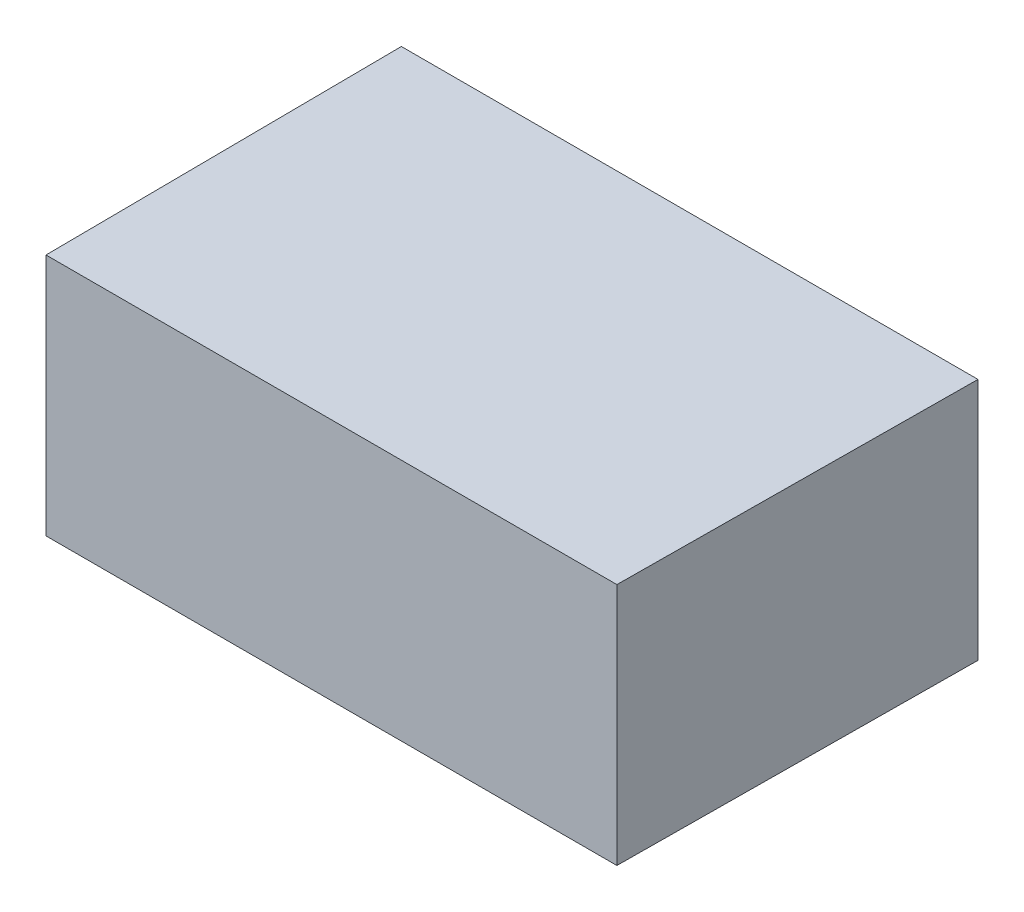
ISO-10303-21;
HEADER;
FILE_DESCRIPTION(('STEP AP214'),'2;1');
FILE_NAME('part.step','',(''),(''),'','','');
FILE_SCHEMA(('AUTOMOTIVE_DESIGN { 1 0 10303 214 1 1 1 1 }'));
ENDSEC;
DATA;
#1=APPLICATION_CONTEXT('core data for automotive mechanical design processes');
#2=APPLICATION_PROTOCOL_DEFINITION('international standard','automotive_design',2000,#1);
#3=PRODUCT_CONTEXT('',#1,'mechanical');
#4=PRODUCT('Part','Part','',(#3));
#5=PRODUCT_RELATED_PRODUCT_CATEGORY('part','',(#4));
#6=PRODUCT_DEFINITION_FORMATION('','',#4);
#7=PRODUCT_DEFINITION_CONTEXT('part definition',#1,'design');
#8=PRODUCT_DEFINITION('design','',#6,#7);
#9=PRODUCT_DEFINITION_SHAPE('','',#8);
#10=(LENGTH_UNIT() NAMED_UNIT(*) SI_UNIT(.MILLI.,.METRE.));
#11=(NAMED_UNIT(*) PLANE_ANGLE_UNIT() SI_UNIT($,.RADIAN.));
#12=(NAMED_UNIT(*) SI_UNIT($,.STERADIAN.) SOLID_ANGLE_UNIT());
#13=UNCERTAINTY_MEASURE_WITH_UNIT(LENGTH_MEASURE(1.E-05),#10,'distance_accuracy_value','');
#14=(GEOMETRIC_REPRESENTATION_CONTEXT(3) GLOBAL_UNCERTAINTY_ASSIGNED_CONTEXT((#13)) GLOBAL_UNIT_ASSIGNED_CONTEXT((#10,
#11,#12)) REPRESENTATION_CONTEXT('',''));
#15=CARTESIAN_POINT('',(0.,0.,0.));
#16=DIRECTION('',(0.,0.,1.));
#17=DIRECTION('',(1.,0.,0.));
#18=AXIS2_PLACEMENT_3D('',#15,#16,#17);
#19=CARTESIAN_POINT('',(-75.25,-31.75,0.));
#20=DIRECTION('',(0.,0.,1.));
#21=DIRECTION('',(1.,0.,0.));
#22=AXIS2_PLACEMENT_3D('',#19,#20,#21);
#23=PLANE('',#22);
#24=DIRECTION('',(1.,0.,0.));
#25=VECTOR('',#24,1.);
#26=CARTESIAN_POINT('',(-59.25,-24.75,0.));
#27=LINE('',#26,#25);
#28=CARTESIAN_POINT('',(-60.25,-24.75,0.));
#29=VERTEX_POINT('',#28);
#30=CARTESIAN_POINT('',(-59.25,-24.75,0.));
#31=VERTEX_POINT('',#30);
#32=EDGE_CURVE('E203',#29,#31,#27,.T.);
#33=ORIENTED_EDGE('',*,*,#32,.T.);
#34=DIRECTION('',(0.,1.,0.));
#35=VECTOR('',#34,1.);
#36=CARTESIAN_POINT('',(-59.25,-24.75,0.));
#37=LINE('',#36,#35);
#38=CARTESIAN_POINT('',(-59.25,-17.75,0.));
#39=VERTEX_POINT('',#38);
#40=EDGE_CURVE('E187',#31,#39,#37,.T.);
#41=ORIENTED_EDGE('',*,*,#40,.T.);
#42=DIRECTION('',(-1.,0.,0.));
#43=VECTOR('',#42,1.);
#44=CARTESIAN_POINT('',(-59.25,-17.75,0.));
#45=LINE('',#44,#43);
#46=CARTESIAN_POINT('',(-60.25,-17.75,0.));
#47=VERTEX_POINT('',#46);
#48=EDGE_CURVE('E209',#39,#47,#45,.T.);
#49=ORIENTED_EDGE('',*,*,#48,.T.);
#50=DIRECTION('',(0.,-1.,0.));
#51=VECTOR('',#50,1.);
#52=CARTESIAN_POINT('',(-60.25,-24.75,0.));
#53=LINE('',#52,#51);
#54=EDGE_CURVE('E206',#47,#29,#53,.T.);
#55=ORIENTED_EDGE('',*,*,#54,.T.);
#56=EDGE_LOOP('',(#33,#41,#49,#55));
#57=FACE_BOUND('',#56,.T.);
#58=DIRECTION('',(0.,-1.,0.));
#59=VECTOR('',#58,1.);
#60=CARTESIAN_POINT('',(-75.25,31.75,0.));
#61=LINE('',#60,#59);
#62=CARTESIAN_POINT('',(-75.25,31.75,0.));
#63=VERTEX_POINT('',#62);
#64=CARTESIAN_POINT('',(-75.25,-31.75,0.));
#65=VERTEX_POINT('',#64);
#66=EDGE_CURVE('E168',#63,#65,#61,.T.);
#67=ORIENTED_EDGE('',*,*,#66,.F.);
#68=DIRECTION('',(-1.,0.,0.));
#69=VECTOR('',#68,1.);
#70=CARTESIAN_POINT('',(-75.25,31.75,0.));
#71=LINE('',#70,#69);
#72=CARTESIAN_POINT('',(75.25,31.75,0.));
#73=VERTEX_POINT('',#72);
#74=EDGE_CURVE('E41',#73,#63,#71,.T.);
#75=ORIENTED_EDGE('',*,*,#74,.F.);
#76=DIRECTION('',(0.,1.,0.));
#77=VECTOR('',#76,1.);
#78=CARTESIAN_POINT('',(75.25,31.75,0.));
#79=LINE('',#78,#77);
#80=CARTESIAN_POINT('',(75.25,-31.75,0.));
#81=VERTEX_POINT('',#80);
#82=EDGE_CURVE('E150',#81,#73,#79,.T.);
#83=ORIENTED_EDGE('',*,*,#82,.F.);
#84=DIRECTION('',(1.,0.,0.));
#85=VECTOR('',#84,1.);
#86=CARTESIAN_POINT('',(-75.25,-31.75,0.));
#87=LINE('',#86,#85);
#88=EDGE_CURVE('E158',#65,#81,#87,.T.);
#89=ORIENTED_EDGE('',*,*,#88,.F.);
#90=EDGE_LOOP('',(#67,#75,#83,#89));
#91=FACE_BOUND('',#90,.T.);
#92=DIRECTION('',(1.,0.,0.));
#93=VECTOR('',#92,1.);
#94=CARTESIAN_POINT('',(-59.25,24.75,0.));
#95=LINE('',#94,#93);
#96=CARTESIAN_POINT('',(-60.25,24.75,0.));
#97=VERTEX_POINT('',#96);
#98=CARTESIAN_POINT('',(-59.25,24.75,0.));
#99=VERTEX_POINT('',#98);
#100=EDGE_CURVE('E256',#97,#99,#95,.T.);
#101=ORIENTED_EDGE('',*,*,#100,.F.);
#102=DIRECTION('',(0.,1.,0.));
#103=VECTOR('',#102,1.);
#104=CARTESIAN_POINT('',(-60.25,24.75,0.));
#105=LINE('',#104,#103);
#106=CARTESIAN_POINT('',(-60.25,17.75,0.));
#107=VERTEX_POINT('',#106);
#108=EDGE_CURVE('E253',#107,#97,#105,.T.);
#109=ORIENTED_EDGE('',*,*,#108,.F.);
#110=DIRECTION('',(-1.,0.,0.));
#111=VECTOR('',#110,1.);
#112=CARTESIAN_POINT('',(-59.25,17.75,0.));
#113=LINE('',#112,#111);
#114=CARTESIAN_POINT('',(-59.25,17.75,0.));
#115=VERTEX_POINT('',#114);
#116=EDGE_CURVE('E250',#115,#107,#113,.T.);
#117=ORIENTED_EDGE('',*,*,#116,.F.);
#118=DIRECTION('',(0.,-1.,0.));
#119=VECTOR('',#118,1.);
#120=CARTESIAN_POINT('',(-59.25,24.75,0.));
#121=LINE('',#120,#119);
#122=EDGE_CURVE('E234',#99,#115,#121,.T.);
#123=ORIENTED_EDGE('',*,*,#122,.F.);
#124=EDGE_LOOP('',(#101,#109,#117,#123));
#125=FACE_BOUND('',#124,.T.);
#126=ADVANCED_FACE('F37',(#57,#91,#125),#23,.F.);
#127=CARTESIAN_POINT('',(-75.25,-31.75,93.5));
#128=DIRECTION('',(0.,1.,0.));
#129=DIRECTION('',(-1.,0.,0.));
#130=AXIS2_PLACEMENT_3D('',#127,#128,#129);
#131=PLANE('',#130);
#132=ORIENTED_EDGE('',*,*,#88,.T.);
#133=DIRECTION('',(0.00802113232781279,0.,-0.999967830200642));
#134=VECTOR('',#133,1.);
#135=CARTESIAN_POINT('',(75.25,-31.75,0.));
#136=LINE('',#135,#134);
#137=CARTESIAN_POINT('',(74.5,-31.75,93.5));
#138=VERTEX_POINT('',#137);
#139=EDGE_CURVE('E153',#138,#81,#136,.T.);
#140=ORIENTED_EDGE('',*,*,#139,.F.);
#141=DIRECTION('',(1.,0.,0.));
#142=VECTOR('',#141,1.);
#143=CARTESIAN_POINT('',(-75.25,-31.75,93.5));
#144=LINE('',#143,#142);
#145=CARTESIAN_POINT('',(-74.5,-31.75,93.5));
#146=VERTEX_POINT('',#145);
#147=EDGE_CURVE('E46',#146,#138,#144,.T.);
#148=ORIENTED_EDGE('',*,*,#147,.F.);
#149=DIRECTION('',(0.00802113232781279,0.,0.999967830200642));
#150=VECTOR('',#149,1.);
#151=CARTESIAN_POINT('',(-75.25,-31.75,0.));
#152=LINE('',#151,#150);
#153=EDGE_CURVE('E62',#65,#146,#152,.T.);
#154=ORIENTED_EDGE('',*,*,#153,.F.);
#155=EDGE_LOOP('',(#132,#140,#148,#154));
#156=FACE_BOUND('',#155,.T.);
#157=ADVANCED_FACE('F39',(#156),#131,.F.);
#158=CARTESIAN_POINT('',(-75.25,31.75,93.5));
#159=DIRECTION('',(0.,-1.,0.));
#160=DIRECTION('',(1.,0.,0.));
#161=AXIS2_PLACEMENT_3D('',#158,#159,#160);
#162=PLANE('',#161);
#163=DIRECTION('',(-1.,0.,0.));
#164=VECTOR('',#163,1.);
#165=CARTESIAN_POINT('',(-75.25,31.75,93.5));
#166=LINE('',#165,#164);
#167=CARTESIAN_POINT('',(74.5,31.75,93.5));
#168=VERTEX_POINT('',#167);
#169=CARTESIAN_POINT('',(-74.5,31.75,93.5));
#170=VERTEX_POINT('',#169);
#171=EDGE_CURVE('E12',#168,#170,#166,.T.);
#172=ORIENTED_EDGE('',*,*,#171,.F.);
#173=DIRECTION('',(0.00802113232781279,0.,-0.999967830200642));
#174=VECTOR('',#173,1.);
#175=CARTESIAN_POINT('',(75.25,31.75,0.));
#176=LINE('',#175,#174);
#177=EDGE_CURVE('E54',#168,#73,#176,.T.);
#178=ORIENTED_EDGE('',*,*,#177,.T.);
#179=ORIENTED_EDGE('',*,*,#74,.T.);
#180=DIRECTION('',(0.00802113232781279,0.,0.999967830200642));
#181=VECTOR('',#180,1.);
#182=CARTESIAN_POINT('',(-75.25,31.75,0.));
#183=LINE('',#182,#181);
#184=EDGE_CURVE('E180',#63,#170,#183,.T.);
#185=ORIENTED_EDGE('',*,*,#184,.T.);
#186=EDGE_LOOP('',(#172,#178,#179,#185));
#187=FACE_BOUND('',#186,.T.);
#188=ADVANCED_FACE('F162',(#187),#162,.F.);
#189=CARTESIAN_POINT('',(-75.25,-31.75,93.5));
#190=DIRECTION('',(0.,0.,1.));
#191=DIRECTION('',(1.,0.,0.));
#192=AXIS2_PLACEMENT_3D('',#189,#190,#191);
#193=PLANE('',#192);
#194=DIRECTION('',(0.,-1.,0.));
#195=VECTOR('',#194,1.);
#196=CARTESIAN_POINT('',(74.5,31.75,93.5));
#197=LINE('',#196,#195);
#198=EDGE_CURVE('E165',#168,#138,#197,.T.);
#199=ORIENTED_EDGE('',*,*,#198,.F.);
#200=ORIENTED_EDGE('',*,*,#171,.T.);
#201=DIRECTION('',(0.,-1.,0.));
#202=VECTOR('',#201,1.);
#203=CARTESIAN_POINT('',(-74.5,31.75,93.5));
#204=LINE('',#203,#202);
#205=EDGE_CURVE('E182',#170,#146,#204,.T.);
#206=ORIENTED_EDGE('',*,*,#205,.T.);
#207=ORIENTED_EDGE('',*,*,#147,.T.);
#208=EDGE_LOOP('',(#199,#200,#206,#207));
#209=FACE_BOUND('',#208,.T.);
#210=ADVANCED_FACE('F316',(#209),#193,.T.);
#211=CARTESIAN_POINT('',(-60.25,24.75,-4.5));
#212=DIRECTION('',(0.,0.,-1.));
#213=DIRECTION('',(-1.,0.,0.));
#214=AXIS2_PLACEMENT_3D('',#211,#212,#213);
#215=PLANE('',#214);
#216=DIRECTION('',(1.,0.,0.));
#217=VECTOR('',#216,1.);
#218=CARTESIAN_POINT('',(-60.25,24.75,-4.5));
#219=LINE('',#218,#217);
#220=CARTESIAN_POINT('',(-60.25,24.75,-4.5));
#221=VERTEX_POINT('',#220);
#222=CARTESIAN_POINT('',(-48.75,24.75,-4.5));
#223=VERTEX_POINT('',#222);
#224=EDGE_CURVE('E272',#221,#223,#219,.T.);
#225=ORIENTED_EDGE('',*,*,#224,.T.);
#226=DIRECTION('',(0.,-1.,0.));
#227=VECTOR('',#226,1.);
#228=CARTESIAN_POINT('',(-48.75,24.75,-4.5));
#229=LINE('',#228,#227);
#230=CARTESIAN_POINT('',(-48.75,17.75,-4.5));
#231=VERTEX_POINT('',#230);
#232=EDGE_CURVE('E237',#223,#231,#229,.T.);
#233=ORIENTED_EDGE('',*,*,#232,.T.);
#234=DIRECTION('',(1.,0.,0.));
#235=VECTOR('',#234,1.);
#236=CARTESIAN_POINT('',(-60.25,17.75,-4.5));
#237=LINE('',#236,#235);
#238=CARTESIAN_POINT('',(-60.25,17.75,-4.5));
#239=VERTEX_POINT('',#238);
#240=EDGE_CURVE('E275',#239,#231,#237,.T.);
#241=ORIENTED_EDGE('',*,*,#240,.F.);
#242=DIRECTION('',(0.,1.,0.));
#243=VECTOR('',#242,1.);
#244=CARTESIAN_POINT('',(-60.25,24.75,-4.5));
#245=LINE('',#244,#243);
#246=EDGE_CURVE('E243',#239,#221,#245,.T.);
#247=ORIENTED_EDGE('',*,*,#246,.T.);
#248=EDGE_LOOP('',(#225,#233,#241,#247));
#249=FACE_BOUND('',#248,.T.);
#250=ADVANCED_FACE('F294',(#249),#215,.T.);
#251=CARTESIAN_POINT('',(-59.25,24.75,-3.5));
#252=DIRECTION('',(0.,0.,1.));
#253=DIRECTION('',(1.,0.,0.));
#254=AXIS2_PLACEMENT_3D('',#251,#252,#253);
#255=PLANE('',#254);
#256=DIRECTION('',(1.,0.,0.));
#257=VECTOR('',#256,1.);
#258=CARTESIAN_POINT('',(-59.25,17.75,-3.5));
#259=LINE('',#258,#257);
#260=CARTESIAN_POINT('',(-59.25,17.75,-3.5));
#261=VERTEX_POINT('',#260);
#262=CARTESIAN_POINT('',(-48.75,17.75,-3.5));
#263=VERTEX_POINT('',#262);
#264=EDGE_CURVE('E278',#261,#263,#259,.T.);
#265=ORIENTED_EDGE('',*,*,#264,.T.);
#266=DIRECTION('',(0.,1.,0.));
#267=VECTOR('',#266,1.);
#268=CARTESIAN_POINT('',(-48.75,24.75,-3.5));
#269=LINE('',#268,#267);
#270=CARTESIAN_POINT('',(-48.75,24.75,-3.5));
#271=VERTEX_POINT('',#270);
#272=EDGE_CURVE('E174',#263,#271,#269,.T.);
#273=ORIENTED_EDGE('',*,*,#272,.T.);
#274=DIRECTION('',(1.,0.,0.));
#275=VECTOR('',#274,1.);
#276=CARTESIAN_POINT('',(-59.25,24.75,-3.5));
#277=LINE('',#276,#275);
#278=CARTESIAN_POINT('',(-59.25,24.75,-3.5));
#279=VERTEX_POINT('',#278);
#280=EDGE_CURVE('E280',#279,#271,#277,.T.);
#281=ORIENTED_EDGE('',*,*,#280,.F.);
#282=DIRECTION('',(0.,-1.,0.));
#283=VECTOR('',#282,1.);
#284=CARTESIAN_POINT('',(-59.25,24.75,-3.5));
#285=LINE('',#284,#283);
#286=EDGE_CURVE('E246',#279,#261,#285,.T.);
#287=ORIENTED_EDGE('',*,*,#286,.T.);
#288=EDGE_LOOP('',(#265,#273,#281,#287));
#289=FACE_BOUND('',#288,.T.);
#290=ADVANCED_FACE('F286',(#289),#255,.T.);
#291=CARTESIAN_POINT('',(-59.25,24.75,-11.0710678118655));
#292=DIRECTION('',(0.,-1.,0.));
#293=DIRECTION('',(0.,0.,-1.));
#294=AXIS2_PLACEMENT_3D('',#291,#292,#293);
#295=PLANE('',#294);
#296=DIRECTION('',(0.,0.,1.));
#297=VECTOR('',#296,1.);
#298=CARTESIAN_POINT('',(-59.25,24.75,-11.0710678118655));
#299=LINE('',#298,#297);
#300=EDGE_CURVE('E259',#279,#99,#299,.T.);
#301=ORIENTED_EDGE('',*,*,#300,.F.);
#302=ORIENTED_EDGE('',*,*,#280,.T.);
#303=DIRECTION('',(0.,0.,-1.));
#304=VECTOR('',#303,1.);
#305=CARTESIAN_POINT('',(-48.75,24.75,-7.28553390593274));
#306=LINE('',#305,#304);
#307=EDGE_CURVE('E240',#271,#223,#306,.T.);
#308=ORIENTED_EDGE('',*,*,#307,.T.);
#309=ORIENTED_EDGE('',*,*,#224,.F.);
#310=DIRECTION('',(0.,0.,1.));
#311=VECTOR('',#310,1.);
#312=CARTESIAN_POINT('',(-60.25,24.75,-11.0710678118655));
#313=LINE('',#312,#311);
#314=EDGE_CURVE('E262',#221,#97,#313,.T.);
#315=ORIENTED_EDGE('',*,*,#314,.T.);
#316=ORIENTED_EDGE('',*,*,#100,.T.);
#317=EDGE_LOOP('',(#301,#302,#308,#309,#315,#316));
#318=FACE_BOUND('',#317,.T.);
#319=ADVANCED_FACE('F296',(#318),#295,.F.);
#320=CARTESIAN_POINT('',(-60.25,24.75,-11.0710678118655));
#321=DIRECTION('',(1.,0.,0.));
#322=DIRECTION('',(0.,0.,-1.));
#323=AXIS2_PLACEMENT_3D('',#320,#321,#322);
#324=PLANE('',#323);
#325=ORIENTED_EDGE('',*,*,#246,.F.);
#326=DIRECTION('',(0.,0.,1.));
#327=VECTOR('',#326,1.);
#328=CARTESIAN_POINT('',(-60.25,17.75,-11.0710678118655));
#329=LINE('',#328,#327);
#330=EDGE_CURVE('E265',#239,#107,#329,.T.);
#331=ORIENTED_EDGE('',*,*,#330,.T.);
#332=ORIENTED_EDGE('',*,*,#108,.T.);
#333=ORIENTED_EDGE('',*,*,#314,.F.);
#334=EDGE_LOOP('',(#325,#331,#332,#333));
#335=FACE_BOUND('',#334,.T.);
#336=ADVANCED_FACE('F299',(#335),#324,.F.);
#337=CARTESIAN_POINT('',(-59.25,17.75,-11.0710678118655));
#338=DIRECTION('',(0.,1.,0.));
#339=DIRECTION('',(0.,0.,1.));
#340=AXIS2_PLACEMENT_3D('',#337,#338,#339);
#341=PLANE('',#340);
#342=ORIENTED_EDGE('',*,*,#330,.F.);
#343=ORIENTED_EDGE('',*,*,#240,.T.);
#344=DIRECTION('',(0.,0.,1.));
#345=VECTOR('',#344,1.);
#346=CARTESIAN_POINT('',(-48.75,17.75,-7.28553390593274));
#347=LINE('',#346,#345);
#348=EDGE_CURVE('E178',#231,#263,#347,.T.);
#349=ORIENTED_EDGE('',*,*,#348,.T.);
#350=ORIENTED_EDGE('',*,*,#264,.F.);
#351=DIRECTION('',(0.,0.,1.));
#352=VECTOR('',#351,1.);
#353=CARTESIAN_POINT('',(-59.25,17.75,-11.0710678118655));
#354=LINE('',#353,#352);
#355=EDGE_CURVE('E247',#261,#115,#354,.T.);
#356=ORIENTED_EDGE('',*,*,#355,.T.);
#357=ORIENTED_EDGE('',*,*,#116,.T.);
#358=EDGE_LOOP('',(#342,#343,#349,#350,#356,#357));
#359=FACE_BOUND('',#358,.T.);
#360=ADVANCED_FACE('F291',(#359),#341,.F.);
#361=CARTESIAN_POINT('',(-59.25,24.75,-11.0710678118655));
#362=DIRECTION('',(-1.,0.,0.));
#363=DIRECTION('',(0.,0.,1.));
#364=AXIS2_PLACEMENT_3D('',#361,#362,#363);
#365=PLANE('',#364);
#366=ORIENTED_EDGE('',*,*,#286,.F.);
#367=ORIENTED_EDGE('',*,*,#300,.T.);
#368=ORIENTED_EDGE('',*,*,#122,.T.);
#369=ORIENTED_EDGE('',*,*,#355,.F.);
#370=EDGE_LOOP('',(#366,#367,#368,#369));
#371=FACE_BOUND('',#370,.T.);
#372=ADVANCED_FACE('F361',(#371),#365,.F.);
#373=CARTESIAN_POINT('',(-48.75,21.25,-4.));
#374=DIRECTION('',(1.,0.,0.));
#375=DIRECTION('',(0.,0.,-1.));
#376=AXIS2_PLACEMENT_3D('',#373,#374,#375);
#377=PLANE('',#376);
#378=ORIENTED_EDGE('',*,*,#272,.F.);
#379=ORIENTED_EDGE('',*,*,#348,.F.);
#380=ORIENTED_EDGE('',*,*,#232,.F.);
#381=ORIENTED_EDGE('',*,*,#307,.F.);
#382=EDGE_LOOP('',(#378,#379,#380,#381));
#383=FACE_BOUND('',#382,.T.);
#384=ADVANCED_FACE('F288',(#383),#377,.T.);
#385=CARTESIAN_POINT('',(-60.25,-24.75,-4.5));
#386=DIRECTION('',(0.,0.,1.));
#387=DIRECTION('',(1.,0.,0.));
#388=AXIS2_PLACEMENT_3D('',#385,#386,#387);
#389=PLANE('',#388);
#390=DIRECTION('',(0.,1.,0.));
#391=VECTOR('',#390,1.);
#392=CARTESIAN_POINT('',(-48.75,-24.75,-4.5));
#393=LINE('',#392,#391);
#394=CARTESIAN_POINT('',(-48.75,-24.75,-4.5));
#395=VERTEX_POINT('',#394);
#396=CARTESIAN_POINT('',(-48.75,-17.75,-4.5));
#397=VERTEX_POINT('',#396);
#398=EDGE_CURVE('E193',#395,#397,#393,.T.);
#399=ORIENTED_EDGE('',*,*,#398,.F.);
#400=DIRECTION('',(1.,0.,0.));
#401=VECTOR('',#400,1.);
#402=CARTESIAN_POINT('',(-60.25,-24.75,-4.5));
#403=LINE('',#402,#401);
#404=CARTESIAN_POINT('',(-60.25,-24.75,-4.5));
#405=VERTEX_POINT('',#404);
#406=EDGE_CURVE('E199',#405,#395,#403,.T.);
#407=ORIENTED_EDGE('',*,*,#406,.F.);
#408=DIRECTION('',(0.,-1.,0.));
#409=VECTOR('',#408,1.);
#410=CARTESIAN_POINT('',(-60.25,-24.75,-4.5));
#411=LINE('',#410,#409);
#412=CARTESIAN_POINT('',(-60.25,-17.75,-4.5));
#413=VERTEX_POINT('',#412);
#414=EDGE_CURVE('E196',#413,#405,#411,.T.);
#415=ORIENTED_EDGE('',*,*,#414,.F.);
#416=DIRECTION('',(1.,0.,0.));
#417=VECTOR('',#416,1.);
#418=CARTESIAN_POINT('',(-60.25,-17.75,-4.5));
#419=LINE('',#418,#417);
#420=EDGE_CURVE('E191',#413,#397,#419,.T.);
#421=ORIENTED_EDGE('',*,*,#420,.T.);
#422=EDGE_LOOP('',(#399,#407,#415,#421));
#423=FACE_BOUND('',#422,.T.);
#424=ADVANCED_FACE('F354',(#423),#389,.F.);
#425=CARTESIAN_POINT('',(-59.25,-24.75,-3.5));
#426=DIRECTION('',(0.,0.,-1.));
#427=DIRECTION('',(-1.,0.,0.));
#428=AXIS2_PLACEMENT_3D('',#425,#426,#427);
#429=PLANE('',#428);
#430=DIRECTION('',(0.,-1.,0.));
#431=VECTOR('',#430,1.);
#432=CARTESIAN_POINT('',(-48.75,-24.75,-3.5));
#433=LINE('',#432,#431);
#434=CARTESIAN_POINT('',(-48.75,-17.75,-3.5));
#435=VERTEX_POINT('',#434);
#436=CARTESIAN_POINT('',(-48.75,-24.75,-3.5));
#437=VERTEX_POINT('',#436);
#438=EDGE_CURVE('E188',#435,#437,#433,.T.);
#439=ORIENTED_EDGE('',*,*,#438,.F.);
#440=DIRECTION('',(1.,0.,0.));
#441=VECTOR('',#440,1.);
#442=CARTESIAN_POINT('',(-59.25,-17.75,-3.5));
#443=LINE('',#442,#441);
#444=CARTESIAN_POINT('',(-59.25,-17.75,-3.5));
#445=VERTEX_POINT('',#444);
#446=EDGE_CURVE('E228',#445,#435,#443,.T.);
#447=ORIENTED_EDGE('',*,*,#446,.F.);
#448=DIRECTION('',(0.,1.,0.));
#449=VECTOR('',#448,1.);
#450=CARTESIAN_POINT('',(-59.25,-24.75,-3.5));
#451=LINE('',#450,#449);
#452=CARTESIAN_POINT('',(-59.25,-24.75,-3.5));
#453=VERTEX_POINT('',#452);
#454=EDGE_CURVE('E200',#453,#445,#451,.T.);
#455=ORIENTED_EDGE('',*,*,#454,.F.);
#456=DIRECTION('',(1.,0.,0.));
#457=VECTOR('',#456,1.);
#458=CARTESIAN_POINT('',(-59.25,-24.75,-3.5));
#459=LINE('',#458,#457);
#460=EDGE_CURVE('E225',#453,#437,#459,.T.);
#461=ORIENTED_EDGE('',*,*,#460,.T.);
#462=EDGE_LOOP('',(#439,#447,#455,#461));
#463=FACE_BOUND('',#462,.T.);
#464=ADVANCED_FACE('F352',(#463),#429,.F.);
#465=CARTESIAN_POINT('',(-59.25,-24.75,-11.0710678118655));
#466=DIRECTION('',(1.,0.,0.));
#467=DIRECTION('',(0.,0.,-1.));
#468=AXIS2_PLACEMENT_3D('',#465,#466,#467);
#469=PLANE('',#468);
#470=DIRECTION('',(0.,0.,1.));
#471=VECTOR('',#470,1.);
#472=CARTESIAN_POINT('',(-59.25,-24.75,-11.0710678118655));
#473=LINE('',#472,#471);
#474=EDGE_CURVE('E218',#453,#31,#473,.T.);
#475=ORIENTED_EDGE('',*,*,#474,.F.);
#476=ORIENTED_EDGE('',*,*,#454,.T.);
#477=DIRECTION('',(0.,0.,1.));
#478=VECTOR('',#477,1.);
#479=CARTESIAN_POINT('',(-59.25,-17.75,-11.0710678118655));
#480=LINE('',#479,#478);
#481=EDGE_CURVE('E212',#445,#39,#480,.T.);
#482=ORIENTED_EDGE('',*,*,#481,.T.);
#483=ORIENTED_EDGE('',*,*,#40,.F.);
#484=EDGE_LOOP('',(#475,#476,#482,#483));
#485=FACE_BOUND('',#484,.T.);
#486=ADVANCED_FACE('F342',(#485),#469,.T.);
#487=CARTESIAN_POINT('',(-59.25,-17.75,-11.0710678118655));
#488=DIRECTION('',(0.,1.,0.));
#489=DIRECTION('',(0.,0.,1.));
#490=AXIS2_PLACEMENT_3D('',#487,#488,#489);
#491=PLANE('',#490);
#492=ORIENTED_EDGE('',*,*,#481,.F.);
#493=ORIENTED_EDGE('',*,*,#446,.T.);
#494=DIRECTION('',(0.,0.,1.));
#495=VECTOR('',#494,1.);
#496=CARTESIAN_POINT('',(-48.75,-17.75,-7.28553390593274));
#497=LINE('',#496,#495);
#498=EDGE_CURVE('E195',#397,#435,#497,.T.);
#499=ORIENTED_EDGE('',*,*,#498,.F.);
#500=ORIENTED_EDGE('',*,*,#420,.F.);
#501=DIRECTION('',(0.,0.,1.));
#502=VECTOR('',#501,1.);
#503=CARTESIAN_POINT('',(-60.25,-17.75,-11.0710678118655));
#504=LINE('',#503,#502);
#505=EDGE_CURVE('E214',#413,#47,#504,.T.);
#506=ORIENTED_EDGE('',*,*,#505,.T.);
#507=ORIENTED_EDGE('',*,*,#48,.F.);
#508=EDGE_LOOP('',(#492,#493,#499,#500,#506,#507));
#509=FACE_BOUND('',#508,.T.);
#510=ADVANCED_FACE('F338',(#509),#491,.T.);
#511=CARTESIAN_POINT('',(-60.25,-24.75,-11.0710678118655));
#512=DIRECTION('',(-1.,0.,0.));
#513=DIRECTION('',(0.,0.,1.));
#514=AXIS2_PLACEMENT_3D('',#511,#512,#513);
#515=PLANE('',#514);
#516=ORIENTED_EDGE('',*,*,#505,.F.);
#517=ORIENTED_EDGE('',*,*,#414,.T.);
#518=DIRECTION('',(0.,0.,1.));
#519=VECTOR('',#518,1.);
#520=CARTESIAN_POINT('',(-60.25,-24.75,-11.0710678118655));
#521=LINE('',#520,#519);
#522=EDGE_CURVE('E216',#405,#29,#521,.T.);
#523=ORIENTED_EDGE('',*,*,#522,.T.);
#524=ORIENTED_EDGE('',*,*,#54,.F.);
#525=EDGE_LOOP('',(#516,#517,#523,#524));
#526=FACE_BOUND('',#525,.T.);
#527=ADVANCED_FACE('F341',(#526),#515,.T.);
#528=CARTESIAN_POINT('',(-59.25,-24.75,-11.0710678118655));
#529=DIRECTION('',(0.,-1.,0.));
#530=DIRECTION('',(0.,0.,-1.));
#531=AXIS2_PLACEMENT_3D('',#528,#529,#530);
#532=PLANE('',#531);
#533=ORIENTED_EDGE('',*,*,#522,.F.);
#534=ORIENTED_EDGE('',*,*,#406,.T.);
#535=DIRECTION('',(0.,0.,-1.));
#536=VECTOR('',#535,1.);
#537=CARTESIAN_POINT('',(-48.75,-24.75,-7.28553390593274));
#538=LINE('',#537,#536);
#539=EDGE_CURVE('E190',#437,#395,#538,.T.);
#540=ORIENTED_EDGE('',*,*,#539,.F.);
#541=ORIENTED_EDGE('',*,*,#460,.F.);
#542=ORIENTED_EDGE('',*,*,#474,.T.);
#543=ORIENTED_EDGE('',*,*,#32,.F.);
#544=EDGE_LOOP('',(#533,#534,#540,#541,#542,#543));
#545=FACE_BOUND('',#544,.T.);
#546=ADVANCED_FACE('F334',(#545),#532,.T.);
#547=CARTESIAN_POINT('',(-48.75,-21.25,-4.));
#548=DIRECTION('',(1.,0.,0.));
#549=DIRECTION('',(0.,0.,-1.));
#550=AXIS2_PLACEMENT_3D('',#547,#548,#549);
#551=PLANE('',#550);
#552=ORIENTED_EDGE('',*,*,#398,.T.);
#553=ORIENTED_EDGE('',*,*,#498,.T.);
#554=ORIENTED_EDGE('',*,*,#438,.T.);
#555=ORIENTED_EDGE('',*,*,#539,.T.);
#556=EDGE_LOOP('',(#552,#553,#554,#555));
#557=FACE_BOUND('',#556,.T.);
#558=ADVANCED_FACE('F327',(#557),#551,.T.);
#559=CARTESIAN_POINT('',(-75.25,31.75,0.));
#560=DIRECTION('',(0.999967830200642,0.,-0.00802113232781279));
#561=DIRECTION('',(-0.00802113232781279,0.,-0.999967830200642));
#562=AXIS2_PLACEMENT_3D('',#559,#560,#561);
#563=PLANE('',#562);
#564=ORIENTED_EDGE('',*,*,#153,.T.);
#565=ORIENTED_EDGE('',*,*,#205,.F.);
#566=ORIENTED_EDGE('',*,*,#184,.F.);
#567=ORIENTED_EDGE('',*,*,#66,.T.);
#568=EDGE_LOOP('',(#564,#565,#566,#567));
#569=FACE_BOUND('',#568,.T.);
#570=ADVANCED_FACE('F325',(#569),#563,.F.);
#571=CARTESIAN_POINT('',(75.25,31.75,0.));
#572=DIRECTION('',(-0.999967830200642,0.,-0.00802113232781279));
#573=DIRECTION('',(-0.00802113232781279,0.,0.999967830200642));
#574=AXIS2_PLACEMENT_3D('',#571,#572,#573);
#575=PLANE('',#574);
#576=ORIENTED_EDGE('',*,*,#139,.T.);
#577=ORIENTED_EDGE('',*,*,#82,.T.);
#578=ORIENTED_EDGE('',*,*,#177,.F.);
#579=ORIENTED_EDGE('',*,*,#198,.T.);
#580=EDGE_LOOP('',(#576,#577,#578,#579));
#581=FACE_BOUND('',#580,.T.);
#582=ADVANCED_FACE('F151',(#581),#575,.F.);
#583=CLOSED_SHELL('',(#126,#157,#188,#210,#250,#290,#319,#336,#360,#372,#384,#424,#464,#486,
#510,#527,#546,#558,#570,#582));
#584=MANIFOLD_SOLID_BREP('B2',#583);
#585=ADVANCED_BREP_SHAPE_REPRESENTATION('',(#18,#584),#14);
#586=SHAPE_DEFINITION_REPRESENTATION(#9,#585);
ENDSEC;
END-ISO-10303-21;
